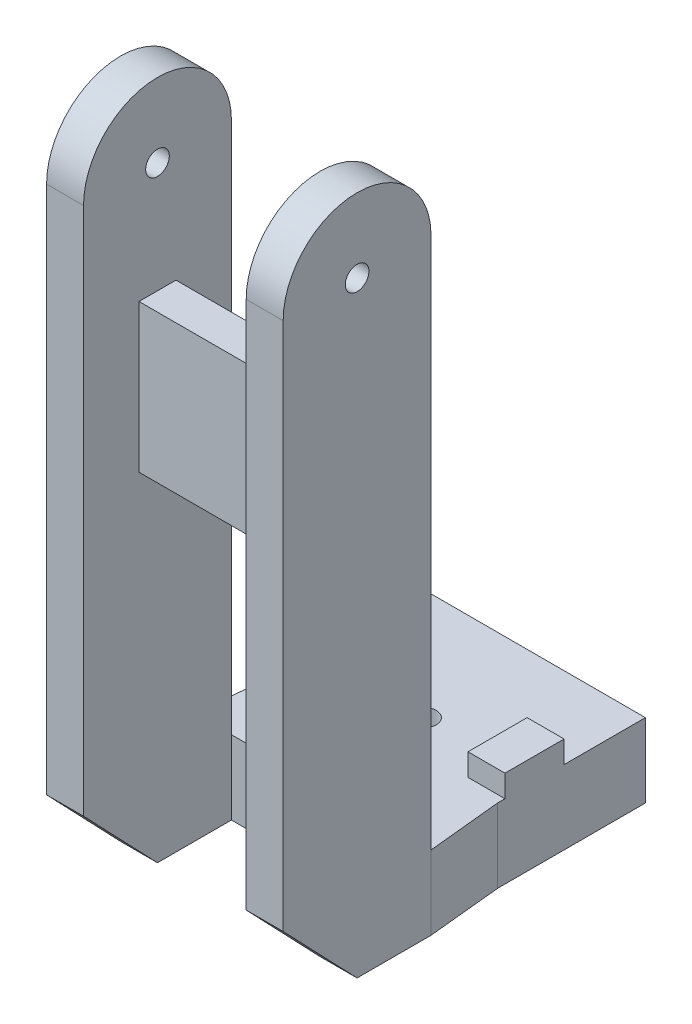
ISO-10303-21;
HEADER;
FILE_DESCRIPTION(('STEP AP214'),'2;1');
FILE_NAME('part.step','',(''),(''),'','','');
FILE_SCHEMA(('AUTOMOTIVE_DESIGN { 1 0 10303 214 1 1 1 1 }'));
ENDSEC;
DATA;
#1=APPLICATION_CONTEXT('core data for automotive mechanical design processes');
#2=APPLICATION_PROTOCOL_DEFINITION('international standard','automotive_design',2000,#1);
#3=PRODUCT_CONTEXT('',#1,'mechanical');
#4=PRODUCT('Part','Part','',(#3));
#5=PRODUCT_RELATED_PRODUCT_CATEGORY('part','',(#4));
#6=PRODUCT_DEFINITION_FORMATION('','',#4);
#7=PRODUCT_DEFINITION_CONTEXT('part definition',#1,'design');
#8=PRODUCT_DEFINITION('design','',#6,#7);
#9=PRODUCT_DEFINITION_SHAPE('','',#8);
#10=(LENGTH_UNIT() NAMED_UNIT(*) SI_UNIT(.MILLI.,.METRE.));
#11=(NAMED_UNIT(*) PLANE_ANGLE_UNIT() SI_UNIT($,.RADIAN.));
#12=(NAMED_UNIT(*) SI_UNIT($,.STERADIAN.) SOLID_ANGLE_UNIT());
#13=UNCERTAINTY_MEASURE_WITH_UNIT(LENGTH_MEASURE(1.E-05),#10,'distance_accuracy_value','');
#14=(GEOMETRIC_REPRESENTATION_CONTEXT(3) GLOBAL_UNCERTAINTY_ASSIGNED_CONTEXT((#13)) GLOBAL_UNIT_ASSIGNED_CONTEXT((#10,
#11,#12)) REPRESENTATION_CONTEXT('',''));
#15=CARTESIAN_POINT('',(0.,0.,0.));
#16=DIRECTION('',(0.,0.,1.));
#17=DIRECTION('',(1.,0.,0.));
#18=AXIS2_PLACEMENT_3D('',#15,#16,#17);
#19=CARTESIAN_POINT('',(4.,72.,10.));
#20=DIRECTION('',(1.,0.,0.));
#21=DIRECTION('',(0.,0.,-1.));
#22=AXIS2_PLACEMENT_3D('',#19,#20,#21);
#23=PLANE('',#22);
#24=CARTESIAN_POINT('',(4.,72.,10.));
#25=DIRECTION('',(1.,0.,0.));
#26=DIRECTION('',(0.,0.,-1.));
#27=AXIS2_PLACEMENT_3D('',#24,#25,#26);
#28=CIRCLE('',#27,1.6);
#29=CARTESIAN_POINT('',(4.,72.,8.4));
#30=VERTEX_POINT('',#29);
#31=EDGE_CURVE('E250',#30,#30,#28,.T.);
#32=ORIENTED_EDGE('',*,*,#31,.F.);
#33=EDGE_LOOP('',(#32));
#34=FACE_BOUND('',#33,.T.);
#35=DIRECTION('',(0.,0.,-1.));
#36=VECTOR('',#35,1.);
#37=CARTESIAN_POINT('',(4.,-10.,10.));
#38=LINE('',#37,#36);
#39=CARTESIAN_POINT('',(4.,-10.,10.));
#40=VERTEX_POINT('',#39);
#41=CARTESIAN_POINT('',(4.,-10.,0.));
#42=VERTEX_POINT('',#41);
#43=EDGE_CURVE('E251',#40,#42,#38,.T.);
#44=ORIENTED_EDGE('',*,*,#43,.T.);
#45=DIRECTION('',(0.,1.,0.));
#46=VECTOR('',#45,1.);
#47=CARTESIAN_POINT('',(4.,-10.,0.));
#48=LINE('',#47,#46);
#49=CARTESIAN_POINT('',(4.,0.,0.));
#50=VERTEX_POINT('',#49);
#51=EDGE_CURVE('E256',#42,#50,#48,.T.);
#52=ORIENTED_EDGE('',*,*,#51,.T.);
#53=CARTESIAN_POINT('',(4.,72.,0.));
#54=VERTEX_POINT('',#53);
#55=EDGE_CURVE('E254',#50,#54,#48,.T.);
#56=ORIENTED_EDGE('',*,*,#55,.T.);
#57=CARTESIAN_POINT('',(4.,72.,10.));
#58=DIRECTION('',(1.,0.,0.));
#59=DIRECTION('',(0.,0.,-1.));
#60=AXIS2_PLACEMENT_3D('',#57,#58,#59);
#61=CIRCLE('',#60,10.);
#62=CARTESIAN_POINT('',(4.,72.,20.));
#63=VERTEX_POINT('',#62);
#64=EDGE_CURVE('E259',#54,#63,#61,.T.);
#65=ORIENTED_EDGE('',*,*,#64,.T.);
#66=DIRECTION('',(0.,-1.,0.));
#67=VECTOR('',#66,1.);
#68=CARTESIAN_POINT('',(4.,72.,20.));
#69=LINE('',#68,#67);
#70=CARTESIAN_POINT('',(4.,0.454209648206035,20.));
#71=VERTEX_POINT('',#70);
#72=EDGE_CURVE('E261',#63,#71,#69,.T.);
#73=ORIENTED_EDGE('',*,*,#72,.T.);
#74=DIRECTION('',(0.,-0.722630766582171,-0.691234240463292));
#75=VECTOR('',#74,1.);
#76=CARTESIAN_POINT('',(4.,-10.,10.));
#77=LINE('',#76,#75);
#78=EDGE_CURVE('E263',#71,#40,#77,.T.);
#79=ORIENTED_EDGE('',*,*,#78,.T.);
#80=EDGE_LOOP('',(#44,#52,#56,#65,#73,#79));
#81=FACE_BOUND('',#80,.T.);
#82=DIRECTION('',(0.,0.,-1.));
#83=VECTOR('',#82,1.);
#84=CARTESIAN_POINT('',(4.,37.,12.5));
#85=LINE('',#84,#83);
#86=CARTESIAN_POINT('',(4.,37.,12.5));
#87=VERTEX_POINT('',#86);
#88=CARTESIAN_POINT('',(4.,37.,7.5));
#89=VERTEX_POINT('',#88);
#90=EDGE_CURVE('E245',#87,#89,#85,.T.);
#91=ORIENTED_EDGE('',*,*,#90,.F.);
#92=DIRECTION('',(0.,-1.,0.));
#93=VECTOR('',#92,1.);
#94=CARTESIAN_POINT('',(4.,57.,12.5));
#95=LINE('',#94,#93);
#96=CARTESIAN_POINT('',(4.,57.,12.5));
#97=VERTEX_POINT('',#96);
#98=EDGE_CURVE('E246',#97,#87,#95,.T.);
#99=ORIENTED_EDGE('',*,*,#98,.F.);
#100=DIRECTION('',(0.,0.,1.));
#101=VECTOR('',#100,1.);
#102=CARTESIAN_POINT('',(4.,57.,12.5));
#103=LINE('',#102,#101);
#104=CARTESIAN_POINT('',(4.,57.,7.5));
#105=VERTEX_POINT('',#104);
#106=EDGE_CURVE('E234',#105,#97,#103,.T.);
#107=ORIENTED_EDGE('',*,*,#106,.F.);
#108=DIRECTION('',(0.,1.,0.));
#109=VECTOR('',#108,1.);
#110=CARTESIAN_POINT('',(4.,57.,7.5));
#111=LINE('',#110,#109);
#112=EDGE_CURVE('E52',#89,#105,#111,.T.);
#113=ORIENTED_EDGE('',*,*,#112,.F.);
#114=EDGE_LOOP('',(#91,#99,#107,#113));
#115=FACE_BOUND('',#114,.T.);
#116=ADVANCED_FACE('F35',(#34,#81,#115),#23,.T.);
#117=CARTESIAN_POINT('',(26.,72.,10.));
#118=DIRECTION('',(1.,0.,0.));
#119=DIRECTION('',(0.,0.,-1.));
#120=AXIS2_PLACEMENT_3D('',#117,#118,#119);
#121=PLANE('',#120);
#122=CARTESIAN_POINT('',(26.,72.,10.));
#123=DIRECTION('',(1.,0.,0.));
#124=DIRECTION('',(0.,0.,-1.));
#125=AXIS2_PLACEMENT_3D('',#122,#123,#124);
#126=CIRCLE('',#125,1.6);
#127=CARTESIAN_POINT('',(26.,72.,8.4));
#128=VERTEX_POINT('',#127);
#129=EDGE_CURVE('E825',#128,#128,#126,.T.);
#130=ORIENTED_EDGE('',*,*,#129,.T.);
#131=EDGE_LOOP('',(#130));
#132=FACE_BOUND('',#131,.T.);
#133=DIRECTION('',(0.,0.,-1.));
#134=VECTOR('',#133,1.);
#135=CARTESIAN_POINT('',(26.,-10.,10.));
#136=LINE('',#135,#134);
#137=CARTESIAN_POINT('',(26.,-10.,10.));
#138=VERTEX_POINT('',#137);
#139=CARTESIAN_POINT('',(26.,-10.,0.));
#140=VERTEX_POINT('',#139);
#141=EDGE_CURVE('E227',#138,#140,#136,.T.);
#142=ORIENTED_EDGE('',*,*,#141,.F.);
#143=DIRECTION('',(0.,-0.722630766582171,-0.691234240463292));
#144=VECTOR('',#143,1.);
#145=CARTESIAN_POINT('',(26.,-10.,10.));
#146=LINE('',#145,#144);
#147=CARTESIAN_POINT('',(26.,0.454209648206035,20.));
#148=VERTEX_POINT('',#147);
#149=EDGE_CURVE('E255',#148,#138,#146,.T.);
#150=ORIENTED_EDGE('',*,*,#149,.F.);
#151=DIRECTION('',(0.,-1.,0.));
#152=VECTOR('',#151,1.);
#153=CARTESIAN_POINT('',(26.,10.9084192964121,20.));
#154=LINE('',#153,#152);
#155=CARTESIAN_POINT('',(26.,72.,20.));
#156=VERTEX_POINT('',#155);
#157=EDGE_CURVE('E275',#156,#148,#154,.T.);
#158=ORIENTED_EDGE('',*,*,#157,.F.);
#159=CARTESIAN_POINT('',(26.,72.,10.));
#160=DIRECTION('',(1.,0.,0.));
#161=DIRECTION('',(0.,0.,-1.));
#162=AXIS2_PLACEMENT_3D('',#159,#160,#161);
#163=CIRCLE('',#162,10.);
#164=CARTESIAN_POINT('',(26.,72.,0.));
#165=VERTEX_POINT('',#164);
#166=EDGE_CURVE('E272',#165,#156,#163,.T.);
#167=ORIENTED_EDGE('',*,*,#166,.F.);
#168=DIRECTION('',(0.,1.,0.));
#169=VECTOR('',#168,1.);
#170=CARTESIAN_POINT('',(26.,15.,0.));
#171=LINE('',#170,#169);
#172=CARTESIAN_POINT('',(26.,0.,0.));
#173=VERTEX_POINT('',#172);
#174=EDGE_CURVE('E268',#173,#165,#171,.T.);
#175=ORIENTED_EDGE('',*,*,#174,.F.);
#176=EDGE_CURVE('E269',#140,#173,#171,.T.);
#177=ORIENTED_EDGE('',*,*,#176,.F.);
#178=EDGE_LOOP('',(#142,#150,#158,#167,#175,#177));
#179=FACE_BOUND('',#178,.T.);
#180=DIRECTION('',(0.,-1.,0.));
#181=VECTOR('',#180,1.);
#182=CARTESIAN_POINT('',(26.,57.,12.5));
#183=LINE('',#182,#181);
#184=CARTESIAN_POINT('',(26.,57.,12.5));
#185=VERTEX_POINT('',#184);
#186=CARTESIAN_POINT('',(26.,37.,12.5));
#187=VERTEX_POINT('',#186);
#188=EDGE_CURVE('E60',#185,#187,#183,.T.);
#189=ORIENTED_EDGE('',*,*,#188,.T.);
#190=DIRECTION('',(0.,0.,-1.));
#191=VECTOR('',#190,1.);
#192=CARTESIAN_POINT('',(26.,37.,12.5));
#193=LINE('',#192,#191);
#194=CARTESIAN_POINT('',(26.,37.,7.5));
#195=VERTEX_POINT('',#194);
#196=EDGE_CURVE('E225',#187,#195,#193,.T.);
#197=ORIENTED_EDGE('',*,*,#196,.T.);
#198=DIRECTION('',(0.,1.,0.));
#199=VECTOR('',#198,1.);
#200=CARTESIAN_POINT('',(26.,57.,7.5));
#201=LINE('',#200,#199);
#202=CARTESIAN_POINT('',(26.,57.,7.5));
#203=VERTEX_POINT('',#202);
#204=EDGE_CURVE('E220',#195,#203,#201,.T.);
#205=ORIENTED_EDGE('',*,*,#204,.T.);
#206=DIRECTION('',(0.,0.,1.));
#207=VECTOR('',#206,1.);
#208=CARTESIAN_POINT('',(26.,57.,12.5));
#209=LINE('',#208,#207);
#210=EDGE_CURVE('E223',#203,#185,#209,.T.);
#211=ORIENTED_EDGE('',*,*,#210,.T.);
#212=EDGE_LOOP('',(#189,#197,#205,#211));
#213=FACE_BOUND('',#212,.T.);
#214=ADVANCED_FACE('F221',(#132,#179,#213),#121,.F.);
#215=CARTESIAN_POINT('',(0.,-10.,0.));
#216=DIRECTION('',(0.,1.,0.));
#217=DIRECTION('',(0.,0.,1.));
#218=AXIS2_PLACEMENT_3D('',#215,#216,#217);
#219=PLANE('',#218);
#220=CARTESIAN_POINT('',(15.,-10.,-15.));
#221=DIRECTION('',(0.,-1.,0.));
#222=DIRECTION('',(0.,0.,-1.));
#223=AXIS2_PLACEMENT_3D('',#220,#221,#222);
#224=CIRCLE('',#223,3.15);
#225=CARTESIAN_POINT('',(15.,-10.,-18.15));
#226=VERTEX_POINT('',#225);
#227=EDGE_CURVE('E332',#226,#226,#224,.T.);
#228=ORIENTED_EDGE('',*,*,#227,.F.);
#229=EDGE_LOOP('',(#228));
#230=FACE_BOUND('',#229,.T.);
#231=ORIENTED_EDGE('',*,*,#43,.F.);
#232=DIRECTION('',(-1.,0.,0.));
#233=VECTOR('',#232,1.);
#234=CARTESIAN_POINT('',(31.,-10.,10.));
#235=LINE('',#234,#233);
#236=CARTESIAN_POINT('',(-1.,-10.,10.));
#237=VERTEX_POINT('',#236);
#238=EDGE_CURVE('E297',#40,#237,#235,.T.);
#239=ORIENTED_EDGE('',*,*,#238,.T.);
#240=DIRECTION('',(0.,0.,-1.));
#241=VECTOR('',#240,1.);
#242=CARTESIAN_POINT('',(-1.,-10.,10.));
#243=LINE('',#242,#241);
#244=CARTESIAN_POINT('',(-1.,-10.,0.));
#245=VERTEX_POINT('',#244);
#246=EDGE_CURVE('E284',#237,#245,#243,.T.);
#247=ORIENTED_EDGE('',*,*,#246,.T.);
#248=DIRECTION('',(-0.099503719020999,0.,0.995037190209989));
#249=VECTOR('',#248,1.);
#250=CARTESIAN_POINT('',(0.,-10.,-10.));
#251=LINE('',#250,#249);
#252=CARTESIAN_POINT('',(0.,-10.,-10.));
#253=VERTEX_POINT('',#252);
#254=EDGE_CURVE('E405',#253,#245,#251,.T.);
#255=ORIENTED_EDGE('',*,*,#254,.F.);
#256=DIRECTION('',(0.,0.,1.));
#257=VECTOR('',#256,1.);
#258=CARTESIAN_POINT('',(0.,-10.,-10.));
#259=LINE('',#258,#257);
#260=CARTESIAN_POINT('',(0.,-10.,-30.));
#261=VERTEX_POINT('',#260);
#262=EDGE_CURVE('E402',#261,#253,#259,.T.);
#263=ORIENTED_EDGE('',*,*,#262,.F.);
#264=DIRECTION('',(-1.,0.,0.));
#265=VECTOR('',#264,1.);
#266=CARTESIAN_POINT('',(0.,-10.,-30.));
#267=LINE('',#266,#265);
#268=CARTESIAN_POINT('',(30.,-10.,-30.));
#269=VERTEX_POINT('',#268);
#270=EDGE_CURVE('E399',#269,#261,#267,.T.);
#271=ORIENTED_EDGE('',*,*,#270,.F.);
#272=DIRECTION('',(0.,0.,-1.));
#273=VECTOR('',#272,1.);
#274=CARTESIAN_POINT('',(30.,-10.,-10.));
#275=LINE('',#274,#273);
#276=CARTESIAN_POINT('',(30.,-10.,-10.));
#277=VERTEX_POINT('',#276);
#278=EDGE_CURVE('E395',#277,#269,#275,.T.);
#279=ORIENTED_EDGE('',*,*,#278,.F.);
#280=DIRECTION('',(-0.099503719020999,0.,-0.995037190209989));
#281=VECTOR('',#280,1.);
#282=CARTESIAN_POINT('',(31.,-10.,0.));
#283=LINE('',#282,#281);
#284=CARTESIAN_POINT('',(31.,-10.,0.));
#285=VERTEX_POINT('',#284);
#286=EDGE_CURVE('E392',#285,#277,#283,.T.);
#287=ORIENTED_EDGE('',*,*,#286,.F.);
#288=DIRECTION('',(0.,0.,-1.));
#289=VECTOR('',#288,1.);
#290=CARTESIAN_POINT('',(31.,-10.,10.));
#291=LINE('',#290,#289);
#292=CARTESIAN_POINT('',(31.,-10.,10.));
#293=VERTEX_POINT('',#292);
#294=EDGE_CURVE('E285',#293,#285,#291,.T.);
#295=ORIENTED_EDGE('',*,*,#294,.F.);
#296=EDGE_CURVE('E311',#293,#138,#235,.T.);
#297=ORIENTED_EDGE('',*,*,#296,.T.);
#298=ORIENTED_EDGE('',*,*,#141,.T.);
#299=DIRECTION('',(1.,0.,0.));
#300=VECTOR('',#299,1.);
#301=CARTESIAN_POINT('',(4.,-10.,0.));
#302=LINE('',#301,#300);
#303=EDGE_CURVE('E265',#42,#140,#302,.T.);
#304=ORIENTED_EDGE('',*,*,#303,.F.);
#305=EDGE_LOOP('',(#231,#239,#247,#255,#263,#271,#279,#287,#295,#297,#298,#304));
#306=FACE_BOUND('',#305,.T.);
#307=ADVANCED_FACE('F462',(#230,#306),#219,.F.);
#308=CARTESIAN_POINT('',(31.,15.,0.));
#309=DIRECTION('',(0.,0.,1.));
#310=DIRECTION('',(1.,0.,0.));
#311=AXIS2_PLACEMENT_3D('',#308,#309,#310);
#312=PLANE('',#311);
#313=ORIENTED_EDGE('',*,*,#55,.F.);
#314=DIRECTION('',(1.,0.,0.));
#315=VECTOR('',#314,1.);
#316=CARTESIAN_POINT('',(30.,0.,0.));
#317=LINE('',#316,#315);
#318=CARTESIAN_POINT('',(-1.,0.,0.));
#319=VERTEX_POINT('',#318);
#320=EDGE_CURVE('E407',#319,#50,#317,.T.);
#321=ORIENTED_EDGE('',*,*,#320,.F.);
#322=DIRECTION('',(0.,1.,0.));
#323=VECTOR('',#322,1.);
#324=CARTESIAN_POINT('',(-1.,15.,0.));
#325=LINE('',#324,#323);
#326=CARTESIAN_POINT('',(-1.,72.,0.));
#327=VERTEX_POINT('',#326);
#328=EDGE_CURVE('E300',#319,#327,#325,.T.);
#329=ORIENTED_EDGE('',*,*,#328,.T.);
#330=DIRECTION('',(-1.,0.,0.));
#331=VECTOR('',#330,1.);
#332=CARTESIAN_POINT('',(31.,72.,0.));
#333=LINE('',#332,#331);
#334=EDGE_CURVE('E322',#54,#327,#333,.T.);
#335=ORIENTED_EDGE('',*,*,#334,.F.);
#336=EDGE_LOOP('',(#313,#321,#329,#335));
#337=FACE_BOUND('',#336,.T.);
#338=ADVANCED_FACE('F537',(#337),#312,.F.);
#339=CARTESIAN_POINT('',(31.,72.,10.));
#340=DIRECTION('',(-1.,0.,0.));
#341=DIRECTION('',(0.,0.,1.));
#342=AXIS2_PLACEMENT_3D('',#339,#340,#341);
#343=CYLINDRICAL_SURFACE('',#342,10.);
#344=ORIENTED_EDGE('',*,*,#64,.F.);
#345=ORIENTED_EDGE('',*,*,#334,.T.);
#346=CARTESIAN_POINT('',(-1.,72.,10.));
#347=DIRECTION('',(1.,0.,0.));
#348=DIRECTION('',(0.,0.,-1.));
#349=AXIS2_PLACEMENT_3D('',#346,#347,#348);
#350=CIRCLE('',#349,10.);
#351=CARTESIAN_POINT('',(-1.,72.,20.));
#352=VERTEX_POINT('',#351);
#353=EDGE_CURVE('E303',#327,#352,#350,.T.);
#354=ORIENTED_EDGE('',*,*,#353,.T.);
#355=DIRECTION('',(-1.,0.,0.));
#356=VECTOR('',#355,1.);
#357=CARTESIAN_POINT('',(31.,72.,20.));
#358=LINE('',#357,#356);
#359=EDGE_CURVE('E318',#63,#352,#358,.T.);
#360=ORIENTED_EDGE('',*,*,#359,.F.);
#361=EDGE_LOOP('',(#344,#345,#354,#360));
#362=FACE_BOUND('',#361,.T.);
#363=ADVANCED_FACE('F534',(#362),#343,.T.);
#364=CARTESIAN_POINT('',(31.,10.9084192964121,20.));
#365=DIRECTION('',(0.,0.,-1.));
#366=DIRECTION('',(-1.,0.,0.));
#367=AXIS2_PLACEMENT_3D('',#364,#365,#366);
#368=PLANE('',#367);
#369=ORIENTED_EDGE('',*,*,#72,.F.);
#370=ORIENTED_EDGE('',*,*,#359,.T.);
#371=DIRECTION('',(0.,-1.,0.));
#372=VECTOR('',#371,1.);
#373=CARTESIAN_POINT('',(-1.,10.9084192964121,20.));
#374=LINE('',#373,#372);
#375=CARTESIAN_POINT('',(-1.,0.454209648206035,20.));
#376=VERTEX_POINT('',#375);
#377=EDGE_CURVE('E306',#352,#376,#374,.T.);
#378=ORIENTED_EDGE('',*,*,#377,.T.);
#379=DIRECTION('',(-1.,0.,0.));
#380=VECTOR('',#379,1.);
#381=CARTESIAN_POINT('',(31.,0.454209648206035,20.));
#382=LINE('',#381,#380);
#383=EDGE_CURVE('E314',#71,#376,#382,.T.);
#384=ORIENTED_EDGE('',*,*,#383,.F.);
#385=EDGE_LOOP('',(#369,#370,#378,#384));
#386=FACE_BOUND('',#385,.T.);
#387=ADVANCED_FACE('F531',(#386),#368,.F.);
#388=CARTESIAN_POINT('',(31.,-10.,10.));
#389=DIRECTION('',(0.,0.691234240463292,-0.722630766582171));
#390=DIRECTION('',(0.,0.722630766582171,0.691234240463292));
#391=AXIS2_PLACEMENT_3D('',#388,#389,#390);
#392=PLANE('',#391);
#393=ORIENTED_EDGE('',*,*,#78,.F.);
#394=ORIENTED_EDGE('',*,*,#383,.T.);
#395=DIRECTION('',(0.,-0.722630766582171,-0.691234240463292));
#396=VECTOR('',#395,1.);
#397=CARTESIAN_POINT('',(-1.,-10.,10.));
#398=LINE('',#397,#396);
#399=EDGE_CURVE('E289',#376,#237,#398,.T.);
#400=ORIENTED_EDGE('',*,*,#399,.T.);
#401=ORIENTED_EDGE('',*,*,#238,.F.);
#402=EDGE_LOOP('',(#393,#394,#400,#401));
#403=FACE_BOUND('',#402,.T.);
#404=ADVANCED_FACE('F528',(#403),#392,.F.);
#405=CARTESIAN_POINT('',(0.,0.,0.));
#406=DIRECTION('',(0.,1.,0.));
#407=DIRECTION('',(0.,0.,1.));
#408=AXIS2_PLACEMENT_3D('',#405,#406,#407);
#409=PLANE('',#408);
#410=DIRECTION('',(0.,0.,1.));
#411=VECTOR('',#410,1.);
#412=CARTESIAN_POINT('',(25.,0.,-19.));
#413=LINE('',#412,#411);
#414=CARTESIAN_POINT('',(25.,0.,-19.));
#415=VERTEX_POINT('',#414);
#416=CARTESIAN_POINT('',(25.,0.,-11.));
#417=VERTEX_POINT('',#416);
#418=EDGE_CURVE('E348',#415,#417,#413,.T.);
#419=ORIENTED_EDGE('',*,*,#418,.F.);
#420=DIRECTION('',(-1.,0.,0.));
#421=VECTOR('',#420,1.);
#422=CARTESIAN_POINT('',(30.,0.,-19.));
#423=LINE('',#422,#421);
#424=CARTESIAN_POINT('',(30.,0.,-19.));
#425=VERTEX_POINT('',#424);
#426=EDGE_CURVE('E335',#425,#415,#423,.T.);
#427=ORIENTED_EDGE('',*,*,#426,.F.);
#428=DIRECTION('',(0.,0.,-1.));
#429=VECTOR('',#428,1.);
#430=CARTESIAN_POINT('',(30.,0.,-10.));
#431=LINE('',#430,#429);
#432=CARTESIAN_POINT('',(30.,0.,-30.));
#433=VERTEX_POINT('',#432);
#434=EDGE_CURVE('E413',#425,#433,#431,.T.);
#435=ORIENTED_EDGE('',*,*,#434,.T.);
#436=DIRECTION('',(-1.,0.,0.));
#437=VECTOR('',#436,1.);
#438=CARTESIAN_POINT('',(0.,0.,-30.));
#439=LINE('',#438,#437);
#440=CARTESIAN_POINT('',(0.,0.,-30.));
#441=VERTEX_POINT('',#440);
#442=EDGE_CURVE('E417',#433,#441,#439,.T.);
#443=ORIENTED_EDGE('',*,*,#442,.T.);
#444=DIRECTION('',(0.,0.,1.));
#445=VECTOR('',#444,1.);
#446=CARTESIAN_POINT('',(0.,0.,-10.));
#447=LINE('',#446,#445);
#448=CARTESIAN_POINT('',(0.,0.,-19.));
#449=VERTEX_POINT('',#448);
#450=EDGE_CURVE('E421',#441,#449,#447,.T.);
#451=ORIENTED_EDGE('',*,*,#450,.T.);
#452=DIRECTION('',(-1.,0.,0.));
#453=VECTOR('',#452,1.);
#454=CARTESIAN_POINT('',(0.,0.,-19.));
#455=LINE('',#454,#453);
#456=CARTESIAN_POINT('',(5.,0.,-19.));
#457=VERTEX_POINT('',#456);
#458=EDGE_CURVE('E366',#457,#449,#455,.T.);
#459=ORIENTED_EDGE('',*,*,#458,.F.);
#460=DIRECTION('',(0.,0.,-1.));
#461=VECTOR('',#460,1.);
#462=CARTESIAN_POINT('',(5.,0.,-19.));
#463=LINE('',#462,#461);
#464=CARTESIAN_POINT('',(5.,0.,-11.));
#465=VERTEX_POINT('',#464);
#466=EDGE_CURVE('E375',#465,#457,#463,.T.);
#467=ORIENTED_EDGE('',*,*,#466,.F.);
#468=DIRECTION('',(1.,0.,0.));
#469=VECTOR('',#468,1.);
#470=CARTESIAN_POINT('',(0.,0.,-11.));
#471=LINE('',#470,#469);
#472=CARTESIAN_POINT('',(0.,0.,-11.));
#473=VERTEX_POINT('',#472);
#474=EDGE_CURVE('E361',#473,#465,#471,.T.);
#475=ORIENTED_EDGE('',*,*,#474,.F.);
#476=CARTESIAN_POINT('',(0.,0.,-10.));
#477=VERTEX_POINT('',#476);
#478=EDGE_CURVE('E420',#473,#477,#447,.T.);
#479=ORIENTED_EDGE('',*,*,#478,.T.);
#480=DIRECTION('',(-0.099503719020999,0.,0.995037190209989));
#481=VECTOR('',#480,1.);
#482=CARTESIAN_POINT('',(0.,0.,-10.));
#483=LINE('',#482,#481);
#484=EDGE_CURVE('E396',#477,#319,#483,.T.);
#485=ORIENTED_EDGE('',*,*,#484,.T.);
#486=ORIENTED_EDGE('',*,*,#320,.T.);
#487=DIRECTION('',(-1.,0.,0.));
#488=VECTOR('',#487,1.);
#489=CARTESIAN_POINT('',(0.,0.,0.));
#490=LINE('',#489,#488);
#491=EDGE_CURVE('E282',#173,#50,#490,.T.);
#492=ORIENTED_EDGE('',*,*,#491,.F.);
#493=CARTESIAN_POINT('',(31.,0.,0.));
#494=VERTEX_POINT('',#493);
#495=EDGE_CURVE('E391',#173,#494,#317,.T.);
#496=ORIENTED_EDGE('',*,*,#495,.T.);
#497=DIRECTION('',(-0.099503719020999,0.,-0.995037190209989));
#498=VECTOR('',#497,1.);
#499=CARTESIAN_POINT('',(31.,0.,0.));
#500=LINE('',#499,#498);
#501=CARTESIAN_POINT('',(30.,0.,-10.));
#502=VERTEX_POINT('',#501);
#503=EDGE_CURVE('E410',#494,#502,#500,.T.);
#504=ORIENTED_EDGE('',*,*,#503,.T.);
#505=CARTESIAN_POINT('',(30.,0.,-11.));
#506=VERTEX_POINT('',#505);
#507=EDGE_CURVE('E414',#502,#506,#431,.T.);
#508=ORIENTED_EDGE('',*,*,#507,.T.);
#509=DIRECTION('',(1.,0.,0.));
#510=VECTOR('',#509,1.);
#511=CARTESIAN_POINT('',(30.,0.,-11.));
#512=LINE('',#511,#510);
#513=EDGE_CURVE('E340',#417,#506,#512,.T.);
#514=ORIENTED_EDGE('',*,*,#513,.F.);
#515=EDGE_LOOP('',(#419,#427,#435,#443,#451,#459,#467,#475,#479,#485,#486,#492,#496,#504,#508,#514));
#516=FACE_BOUND('',#515,.T.);
#517=CARTESIAN_POINT('',(15.,0.,-15.));
#518=DIRECTION('',(0.,-1.,0.));
#519=DIRECTION('',(0.,0.,-1.));
#520=AXIS2_PLACEMENT_3D('',#517,#518,#519);
#521=CIRCLE('',#520,1.7);
#522=CARTESIAN_POINT('',(15.,0.,-16.7));
#523=VERTEX_POINT('',#522);
#524=EDGE_CURVE('E326',#523,#523,#521,.T.);
#525=ORIENTED_EDGE('',*,*,#524,.T.);
#526=EDGE_LOOP('',(#525));
#527=FACE_BOUND('',#526,.T.);
#528=ADVANCED_FACE('F474',(#516,#527),#409,.T.);
#529=CARTESIAN_POINT('',(0.,-10.,-10.));
#530=DIRECTION('',(-0.995037190209989,0.,-0.099503719020999));
#531=DIRECTION('',(-0.099503719020999,0.,0.995037190209989));
#532=AXIS2_PLACEMENT_3D('',#529,#530,#531);
#533=PLANE('',#532);
#534=ORIENTED_EDGE('',*,*,#484,.F.);
#535=DIRECTION('',(0.,1.,0.));
#536=VECTOR('',#535,1.);
#537=CARTESIAN_POINT('',(0.,-10.,-10.));
#538=LINE('',#537,#536);
#539=EDGE_CURVE('E44',#253,#477,#538,.T.);
#540=ORIENTED_EDGE('',*,*,#539,.F.);
#541=ORIENTED_EDGE('',*,*,#254,.T.);
#542=DIRECTION('',(0.,1.,0.));
#543=VECTOR('',#542,1.);
#544=CARTESIAN_POINT('',(-1.,-10.,0.));
#545=LINE('',#544,#543);
#546=EDGE_CURVE('E11',#245,#319,#545,.T.);
#547=ORIENTED_EDGE('',*,*,#546,.T.);
#548=EDGE_LOOP('',(#534,#540,#541,#547));
#549=FACE_BOUND('',#548,.T.);
#550=ADVANCED_FACE('F560',(#549),#533,.T.);
#551=CARTESIAN_POINT('',(0.,-10.,-10.));
#552=DIRECTION('',(-1.,0.,0.));
#553=DIRECTION('',(0.,0.,1.));
#554=AXIS2_PLACEMENT_3D('',#551,#552,#553);
#555=PLANE('',#554);
#556=ORIENTED_EDGE('',*,*,#450,.F.);
#557=DIRECTION('',(0.,1.,0.));
#558=VECTOR('',#557,1.);
#559=CARTESIAN_POINT('',(0.,-10.,-30.));
#560=LINE('',#559,#558);
#561=EDGE_CURVE('E427',#261,#441,#560,.T.);
#562=ORIENTED_EDGE('',*,*,#561,.F.);
#563=ORIENTED_EDGE('',*,*,#262,.T.);
#564=ORIENTED_EDGE('',*,*,#539,.T.);
#565=ORIENTED_EDGE('',*,*,#478,.F.);
#566=DIRECTION('',(0.,-1.,0.));
#567=VECTOR('',#566,1.);
#568=CARTESIAN_POINT('',(0.,3.,-11.));
#569=LINE('',#568,#567);
#570=CARTESIAN_POINT('',(0.,3.,-11.));
#571=VERTEX_POINT('',#570);
#572=EDGE_CURVE('E388',#571,#473,#569,.T.);
#573=ORIENTED_EDGE('',*,*,#572,.F.);
#574=DIRECTION('',(0.,0.,1.));
#575=VECTOR('',#574,1.);
#576=CARTESIAN_POINT('',(0.,3.,-19.));
#577=LINE('',#576,#575);
#578=CARTESIAN_POINT('',(0.,3.,-19.));
#579=VERTEX_POINT('',#578);
#580=EDGE_CURVE('E362',#579,#571,#577,.T.);
#581=ORIENTED_EDGE('',*,*,#580,.F.);
#582=DIRECTION('',(0.,-1.,0.));
#583=VECTOR('',#582,1.);
#584=CARTESIAN_POINT('',(0.,3.,-19.));
#585=LINE('',#584,#583);
#586=EDGE_CURVE('E372',#579,#449,#585,.T.);
#587=ORIENTED_EDGE('',*,*,#586,.T.);
#588=EDGE_LOOP('',(#556,#562,#563,#564,#565,#573,#581,#587));
#589=FACE_BOUND('',#588,.T.);
#590=ADVANCED_FACE('F563',(#589),#555,.T.);
#591=CARTESIAN_POINT('',(0.,-10.,-30.));
#592=DIRECTION('',(0.,0.,-1.));
#593=DIRECTION('',(-1.,0.,0.));
#594=AXIS2_PLACEMENT_3D('',#591,#592,#593);
#595=PLANE('',#594);
#596=ORIENTED_EDGE('',*,*,#442,.F.);
#597=DIRECTION('',(0.,1.,0.));
#598=VECTOR('',#597,1.);
#599=CARTESIAN_POINT('',(30.,-10.,-30.));
#600=LINE('',#599,#598);
#601=EDGE_CURVE('E429',#269,#433,#600,.T.);
#602=ORIENTED_EDGE('',*,*,#601,.F.);
#603=ORIENTED_EDGE('',*,*,#270,.T.);
#604=ORIENTED_EDGE('',*,*,#561,.T.);
#605=EDGE_LOOP('',(#596,#602,#603,#604));
#606=FACE_BOUND('',#605,.T.);
#607=ADVANCED_FACE('F567',(#606),#595,.T.);
#608=CARTESIAN_POINT('',(30.,-10.,-10.));
#609=DIRECTION('',(1.,0.,0.));
#610=DIRECTION('',(0.,0.,-1.));
#611=AXIS2_PLACEMENT_3D('',#608,#609,#610);
#612=PLANE('',#611);
#613=ORIENTED_EDGE('',*,*,#507,.F.);
#614=DIRECTION('',(0.,1.,0.));
#615=VECTOR('',#614,1.);
#616=CARTESIAN_POINT('',(30.,-10.,-10.));
#617=LINE('',#616,#615);
#618=EDGE_CURVE('E431',#277,#502,#617,.T.);
#619=ORIENTED_EDGE('',*,*,#618,.F.);
#620=ORIENTED_EDGE('',*,*,#278,.T.);
#621=ORIENTED_EDGE('',*,*,#601,.T.);
#622=ORIENTED_EDGE('',*,*,#434,.F.);
#623=DIRECTION('',(0.,-1.,0.));
#624=VECTOR('',#623,1.);
#625=CARTESIAN_POINT('',(30.,3.,-19.));
#626=LINE('',#625,#624);
#627=CARTESIAN_POINT('',(30.,3.,-19.));
#628=VERTEX_POINT('',#627);
#629=EDGE_CURVE('E359',#628,#425,#626,.T.);
#630=ORIENTED_EDGE('',*,*,#629,.F.);
#631=DIRECTION('',(0.,0.,-1.));
#632=VECTOR('',#631,1.);
#633=CARTESIAN_POINT('',(30.,3.,-19.));
#634=LINE('',#633,#632);
#635=CARTESIAN_POINT('',(30.,3.,-11.));
#636=VERTEX_POINT('',#635);
#637=EDGE_CURVE('E336',#636,#628,#634,.T.);
#638=ORIENTED_EDGE('',*,*,#637,.F.);
#639=DIRECTION('',(0.,-1.,0.));
#640=VECTOR('',#639,1.);
#641=CARTESIAN_POINT('',(30.,3.,-11.));
#642=LINE('',#641,#640);
#643=EDGE_CURVE('E346',#636,#506,#642,.T.);
#644=ORIENTED_EDGE('',*,*,#643,.T.);
#645=EDGE_LOOP('',(#613,#619,#620,#621,#622,#630,#638,#644));
#646=FACE_BOUND('',#645,.T.);
#647=ADVANCED_FACE('F467',(#646),#612,.T.);
#648=CARTESIAN_POINT('',(31.,-10.,0.));
#649=DIRECTION('',(0.995037190209989,0.,-0.099503719020999));
#650=DIRECTION('',(-0.099503719020999,0.,-0.995037190209989));
#651=AXIS2_PLACEMENT_3D('',#648,#649,#650);
#652=PLANE('',#651);
#653=ORIENTED_EDGE('',*,*,#503,.F.);
#654=DIRECTION('',(0.,1.,0.));
#655=VECTOR('',#654,1.);
#656=CARTESIAN_POINT('',(31.,-10.,0.));
#657=LINE('',#656,#655);
#658=EDGE_CURVE('E39',#285,#494,#657,.T.);
#659=ORIENTED_EDGE('',*,*,#658,.F.);
#660=ORIENTED_EDGE('',*,*,#286,.T.);
#661=ORIENTED_EDGE('',*,*,#618,.T.);
#662=EDGE_LOOP('',(#653,#659,#660,#661));
#663=FACE_BOUND('',#662,.T.);
#664=ADVANCED_FACE('F37',(#663),#652,.T.);
#665=CARTESIAN_POINT('',(0.,3.,-11.));
#666=DIRECTION('',(0.,0.,-1.));
#667=DIRECTION('',(-1.,0.,0.));
#668=AXIS2_PLACEMENT_3D('',#665,#666,#667);
#669=PLANE('',#668);
#670=ORIENTED_EDGE('',*,*,#474,.T.);
#671=DIRECTION('',(0.,-1.,0.));
#672=VECTOR('',#671,1.);
#673=CARTESIAN_POINT('',(5.,3.,-11.));
#674=LINE('',#673,#672);
#675=CARTESIAN_POINT('',(5.,3.,-11.));
#676=VERTEX_POINT('',#675);
#677=EDGE_CURVE('E385',#676,#465,#674,.T.);
#678=ORIENTED_EDGE('',*,*,#677,.F.);
#679=DIRECTION('',(1.,0.,0.));
#680=VECTOR('',#679,1.);
#681=CARTESIAN_POINT('',(0.,3.,-11.));
#682=LINE('',#681,#680);
#683=EDGE_CURVE('E365',#571,#676,#682,.T.);
#684=ORIENTED_EDGE('',*,*,#683,.F.);
#685=ORIENTED_EDGE('',*,*,#572,.T.);
#686=EDGE_LOOP('',(#670,#678,#684,#685));
#687=FACE_BOUND('',#686,.T.);
#688=ADVANCED_FACE('F556',(#687),#669,.F.);
#689=CARTESIAN_POINT('',(5.,3.,-19.));
#690=DIRECTION('',(-1.,0.,0.));
#691=DIRECTION('',(0.,0.,1.));
#692=AXIS2_PLACEMENT_3D('',#689,#690,#691);
#693=PLANE('',#692);
#694=ORIENTED_EDGE('',*,*,#466,.T.);
#695=DIRECTION('',(0.,-1.,0.));
#696=VECTOR('',#695,1.);
#697=CARTESIAN_POINT('',(5.,3.,-19.));
#698=LINE('',#697,#696);
#699=CARTESIAN_POINT('',(5.,3.,-19.));
#700=VERTEX_POINT('',#699);
#701=EDGE_CURVE('E382',#700,#457,#698,.T.);
#702=ORIENTED_EDGE('',*,*,#701,.F.);
#703=DIRECTION('',(0.,0.,-1.));
#704=VECTOR('',#703,1.);
#705=CARTESIAN_POINT('',(5.,3.,-19.));
#706=LINE('',#705,#704);
#707=EDGE_CURVE('E368',#676,#700,#706,.T.);
#708=ORIENTED_EDGE('',*,*,#707,.F.);
#709=ORIENTED_EDGE('',*,*,#677,.T.);
#710=EDGE_LOOP('',(#694,#702,#708,#709));
#711=FACE_BOUND('',#710,.T.);
#712=ADVANCED_FACE('F578',(#711),#693,.F.);
#713=CARTESIAN_POINT('',(0.,3.,-19.));
#714=DIRECTION('',(0.,0.,1.));
#715=DIRECTION('',(1.,0.,0.));
#716=AXIS2_PLACEMENT_3D('',#713,#714,#715);
#717=PLANE('',#716);
#718=ORIENTED_EDGE('',*,*,#458,.T.);
#719=ORIENTED_EDGE('',*,*,#586,.F.);
#720=DIRECTION('',(-1.,0.,0.));
#721=VECTOR('',#720,1.);
#722=CARTESIAN_POINT('',(0.,3.,-19.));
#723=LINE('',#722,#721);
#724=EDGE_CURVE('E370',#700,#579,#723,.T.);
#725=ORIENTED_EDGE('',*,*,#724,.F.);
#726=ORIENTED_EDGE('',*,*,#701,.T.);
#727=EDGE_LOOP('',(#718,#719,#725,#726));
#728=FACE_BOUND('',#727,.T.);
#729=ADVANCED_FACE('F583',(#728),#717,.F.);
#730=CARTESIAN_POINT('',(0.,3.,0.));
#731=DIRECTION('',(0.,1.,0.));
#732=DIRECTION('',(0.,0.,1.));
#733=AXIS2_PLACEMENT_3D('',#730,#731,#732);
#734=PLANE('',#733);
#735=ORIENTED_EDGE('',*,*,#580,.T.);
#736=ORIENTED_EDGE('',*,*,#683,.T.);
#737=ORIENTED_EDGE('',*,*,#707,.T.);
#738=ORIENTED_EDGE('',*,*,#724,.T.);
#739=EDGE_LOOP('',(#735,#736,#737,#738));
#740=FACE_BOUND('',#739,.T.);
#741=ADVANCED_FACE('F592',(#740),#734,.T.);
#742=CARTESIAN_POINT('',(30.,3.,-19.));
#743=DIRECTION('',(0.,0.,1.));
#744=DIRECTION('',(1.,0.,0.));
#745=AXIS2_PLACEMENT_3D('',#742,#743,#744);
#746=PLANE('',#745);
#747=ORIENTED_EDGE('',*,*,#426,.T.);
#748=DIRECTION('',(0.,-1.,0.));
#749=VECTOR('',#748,1.);
#750=CARTESIAN_POINT('',(25.,3.,-19.));
#751=LINE('',#750,#749);
#752=CARTESIAN_POINT('',(25.,3.,-19.));
#753=VERTEX_POINT('',#752);
#754=EDGE_CURVE('E356',#753,#415,#751,.T.);
#755=ORIENTED_EDGE('',*,*,#754,.F.);
#756=DIRECTION('',(-1.,0.,0.));
#757=VECTOR('',#756,1.);
#758=CARTESIAN_POINT('',(30.,3.,-19.));
#759=LINE('',#758,#757);
#760=EDGE_CURVE('E339',#628,#753,#759,.T.);
#761=ORIENTED_EDGE('',*,*,#760,.F.);
#762=ORIENTED_EDGE('',*,*,#629,.T.);
#763=EDGE_LOOP('',(#747,#755,#761,#762));
#764=FACE_BOUND('',#763,.T.);
#765=ADVANCED_FACE('F486',(#764),#746,.F.);
#766=CARTESIAN_POINT('',(25.,3.,-19.));
#767=DIRECTION('',(1.,0.,0.));
#768=DIRECTION('',(0.,0.,-1.));
#769=AXIS2_PLACEMENT_3D('',#766,#767,#768);
#770=PLANE('',#769);
#771=ORIENTED_EDGE('',*,*,#418,.T.);
#772=DIRECTION('',(0.,-1.,0.));
#773=VECTOR('',#772,1.);
#774=CARTESIAN_POINT('',(25.,3.,-11.));
#775=LINE('',#774,#773);
#776=CARTESIAN_POINT('',(25.,3.,-11.));
#777=VERTEX_POINT('',#776);
#778=EDGE_CURVE('E354',#777,#417,#775,.T.);
#779=ORIENTED_EDGE('',*,*,#778,.F.);
#780=DIRECTION('',(0.,0.,1.));
#781=VECTOR('',#780,1.);
#782=CARTESIAN_POINT('',(25.,3.,-19.));
#783=LINE('',#782,#781);
#784=EDGE_CURVE('E342',#753,#777,#783,.T.);
#785=ORIENTED_EDGE('',*,*,#784,.F.);
#786=ORIENTED_EDGE('',*,*,#754,.T.);
#787=EDGE_LOOP('',(#771,#779,#785,#786));
#788=FACE_BOUND('',#787,.T.);
#789=ADVANCED_FACE('F483',(#788),#770,.F.);
#790=CARTESIAN_POINT('',(30.,3.,-11.));
#791=DIRECTION('',(0.,0.,-1.));
#792=DIRECTION('',(-1.,0.,0.));
#793=AXIS2_PLACEMENT_3D('',#790,#791,#792);
#794=PLANE('',#793);
#795=ORIENTED_EDGE('',*,*,#513,.T.);
#796=ORIENTED_EDGE('',*,*,#643,.F.);
#797=DIRECTION('',(1.,0.,0.));
#798=VECTOR('',#797,1.);
#799=CARTESIAN_POINT('',(30.,3.,-11.));
#800=LINE('',#799,#798);
#801=EDGE_CURVE('E344',#777,#636,#800,.T.);
#802=ORIENTED_EDGE('',*,*,#801,.F.);
#803=ORIENTED_EDGE('',*,*,#778,.T.);
#804=EDGE_LOOP('',(#795,#796,#802,#803));
#805=FACE_BOUND('',#804,.T.);
#806=ADVANCED_FACE('F478',(#805),#794,.F.);
#807=CARTESIAN_POINT('',(0.,3.,0.));
#808=DIRECTION('',(0.,-1.,0.));
#809=DIRECTION('',(0.,0.,-1.));
#810=AXIS2_PLACEMENT_3D('',#807,#808,#809);
#811=PLANE('',#810);
#812=ORIENTED_EDGE('',*,*,#637,.T.);
#813=ORIENTED_EDGE('',*,*,#760,.T.);
#814=ORIENTED_EDGE('',*,*,#784,.T.);
#815=ORIENTED_EDGE('',*,*,#801,.T.);
#816=EDGE_LOOP('',(#812,#813,#814,#815));
#817=FACE_BOUND('',#816,.T.);
#818=ADVANCED_FACE('F489',(#817),#811,.F.);
#819=CARTESIAN_POINT('',(15.,-10.,-15.));
#820=DIRECTION('',(0.,-1.,0.));
#821=DIRECTION('',(0.,0.,-1.));
#822=AXIS2_PLACEMENT_3D('',#819,#820,#821);
#823=CONICAL_SURFACE('',#822,3.15,0.785398163397448);
#824=CARTESIAN_POINT('',(15.,-8.55,-15.));
#825=DIRECTION('',(0.,-1.,0.));
#826=DIRECTION('',(0.,0.,-1.));
#827=AXIS2_PLACEMENT_3D('',#824,#825,#826);
#828=CIRCLE('',#827,1.7);
#829=CARTESIAN_POINT('',(15.,-8.55,-16.7));
#830=VERTEX_POINT('',#829);
#831=EDGE_CURVE('E329',#830,#830,#828,.T.);
#832=ORIENTED_EDGE('',*,*,#831,.F.);
#833=EDGE_LOOP('',(#832));
#834=FACE_BOUND('',#833,.T.);
#835=ORIENTED_EDGE('',*,*,#227,.T.);
#836=EDGE_LOOP('',(#835));
#837=FACE_BOUND('',#836,.T.);
#838=ADVANCED_FACE('F491',(#834,#837),#823,.F.);
#839=CARTESIAN_POINT('',(15.,-10.,-15.));
#840=DIRECTION('',(0.,-1.,0.));
#841=DIRECTION('',(0.,0.,-1.));
#842=AXIS2_PLACEMENT_3D('',#839,#840,#841);
#843=CYLINDRICAL_SURFACE('',#842,1.7);
#844=ORIENTED_EDGE('',*,*,#524,.F.);
#845=EDGE_LOOP('',(#844));
#846=FACE_BOUND('',#845,.T.);
#847=ORIENTED_EDGE('',*,*,#831,.T.);
#848=EDGE_LOOP('',(#847));
#849=FACE_BOUND('',#848,.T.);
#850=ADVANCED_FACE('F497',(#846,#849),#843,.F.);
#851=ORIENTED_EDGE('',*,*,#495,.F.);
#852=ORIENTED_EDGE('',*,*,#174,.T.);
#853=CARTESIAN_POINT('',(31.,72.,0.));
#854=VERTEX_POINT('',#853);
#855=EDGE_CURVE('E323',#854,#165,#333,.T.);
#856=ORIENTED_EDGE('',*,*,#855,.F.);
#857=DIRECTION('',(0.,1.,0.));
#858=VECTOR('',#857,1.);
#859=CARTESIAN_POINT('',(31.,-10.,0.));
#860=LINE('',#859,#858);
#861=EDGE_CURVE('E288',#494,#854,#860,.T.);
#862=ORIENTED_EDGE('',*,*,#861,.F.);
#863=EDGE_LOOP('',(#851,#852,#856,#862));
#864=FACE_BOUND('',#863,.T.);
#865=ADVANCED_FACE('F445',(#864),#312,.F.);
#866=ORIENTED_EDGE('',*,*,#855,.T.);
#867=ORIENTED_EDGE('',*,*,#166,.T.);
#868=CARTESIAN_POINT('',(31.,72.,20.));
#869=VERTEX_POINT('',#868);
#870=EDGE_CURVE('E319',#869,#156,#358,.T.);
#871=ORIENTED_EDGE('',*,*,#870,.F.);
#872=CARTESIAN_POINT('',(31.,72.,10.));
#873=DIRECTION('',(1.,0.,0.));
#874=DIRECTION('',(0.,0.,-1.));
#875=AXIS2_PLACEMENT_3D('',#872,#873,#874);
#876=CIRCLE('',#875,10.);
#877=EDGE_CURVE('E291',#854,#869,#876,.T.);
#878=ORIENTED_EDGE('',*,*,#877,.F.);
#879=EDGE_LOOP('',(#866,#867,#871,#878));
#880=FACE_BOUND('',#879,.T.);
#881=ADVANCED_FACE('F451',(#880),#343,.T.);
#882=ORIENTED_EDGE('',*,*,#870,.T.);
#883=ORIENTED_EDGE('',*,*,#157,.T.);
#884=CARTESIAN_POINT('',(31.,0.454209648206035,20.));
#885=VERTEX_POINT('',#884);
#886=EDGE_CURVE('E315',#885,#148,#382,.T.);
#887=ORIENTED_EDGE('',*,*,#886,.F.);
#888=DIRECTION('',(0.,-1.,0.));
#889=VECTOR('',#888,1.);
#890=CARTESIAN_POINT('',(31.,72.,20.));
#891=LINE('',#890,#889);
#892=EDGE_CURVE('E293',#869,#885,#891,.T.);
#893=ORIENTED_EDGE('',*,*,#892,.F.);
#894=EDGE_LOOP('',(#882,#883,#887,#893));
#895=FACE_BOUND('',#894,.T.);
#896=ADVANCED_FACE('F457',(#895),#368,.F.);
#897=ORIENTED_EDGE('',*,*,#886,.T.);
#898=ORIENTED_EDGE('',*,*,#149,.T.);
#899=ORIENTED_EDGE('',*,*,#296,.F.);
#900=DIRECTION('',(0.,-0.722630766582171,-0.691234240463292));
#901=VECTOR('',#900,1.);
#902=CARTESIAN_POINT('',(31.,-10.,10.));
#903=LINE('',#902,#901);
#904=EDGE_CURVE('E295',#885,#293,#903,.T.);
#905=ORIENTED_EDGE('',*,*,#904,.F.);
#906=EDGE_LOOP('',(#897,#898,#899,#905));
#907=FACE_BOUND('',#906,.T.);
#908=ADVANCED_FACE('F459',(#907),#392,.F.);
#909=CARTESIAN_POINT('',(31.,72.,10.));
#910=DIRECTION('',(1.,0.,0.));
#911=DIRECTION('',(0.,0.,-1.));
#912=AXIS2_PLACEMENT_3D('',#909,#910,#911);
#913=PLANE('',#912);
#914=CARTESIAN_POINT('',(31.,72.,10.));
#915=DIRECTION('',(1.,0.,0.));
#916=DIRECTION('',(0.,0.,-1.));
#917=AXIS2_PLACEMENT_3D('',#914,#915,#916);
#918=CIRCLE('',#917,1.6);
#919=CARTESIAN_POINT('',(31.,72.,8.4));
#920=VERTEX_POINT('',#919);
#921=EDGE_CURVE('E822',#920,#920,#918,.T.);
#922=ORIENTED_EDGE('',*,*,#921,.F.);
#923=EDGE_LOOP('',(#922));
#924=FACE_BOUND('',#923,.T.);
#925=ORIENTED_EDGE('',*,*,#294,.T.);
#926=ORIENTED_EDGE('',*,*,#658,.T.);
#927=ORIENTED_EDGE('',*,*,#861,.T.);
#928=ORIENTED_EDGE('',*,*,#877,.T.);
#929=ORIENTED_EDGE('',*,*,#892,.T.);
#930=ORIENTED_EDGE('',*,*,#904,.T.);
#931=EDGE_LOOP('',(#925,#926,#927,#928,#929,#930));
#932=FACE_BOUND('',#931,.T.);
#933=ADVANCED_FACE('F438',(#924,#932),#913,.T.);
#934=CARTESIAN_POINT('',(-1.,72.,10.));
#935=DIRECTION('',(1.,0.,0.));
#936=DIRECTION('',(0.,0.,-1.));
#937=AXIS2_PLACEMENT_3D('',#934,#935,#936);
#938=PLANE('',#937);
#939=CARTESIAN_POINT('',(-1.,72.,10.));
#940=DIRECTION('',(1.,0.,0.));
#941=DIRECTION('',(0.,0.,-1.));
#942=AXIS2_PLACEMENT_3D('',#939,#940,#941);
#943=CIRCLE('',#942,1.6);
#944=CARTESIAN_POINT('',(-1.,72.,8.4));
#945=VERTEX_POINT('',#944);
#946=EDGE_CURVE('E821',#945,#945,#943,.T.);
#947=ORIENTED_EDGE('',*,*,#946,.T.);
#948=EDGE_LOOP('',(#947));
#949=FACE_BOUND('',#948,.T.);
#950=ORIENTED_EDGE('',*,*,#246,.F.);
#951=ORIENTED_EDGE('',*,*,#399,.F.);
#952=ORIENTED_EDGE('',*,*,#377,.F.);
#953=ORIENTED_EDGE('',*,*,#353,.F.);
#954=ORIENTED_EDGE('',*,*,#328,.F.);
#955=ORIENTED_EDGE('',*,*,#546,.F.);
#956=EDGE_LOOP('',(#950,#951,#952,#953,#954,#955));
#957=FACE_BOUND('',#956,.T.);
#958=ADVANCED_FACE('F518',(#949,#957),#938,.F.);
#959=CARTESIAN_POINT('',(4.,15.,0.));
#960=DIRECTION('',(0.,0.,-1.));
#961=DIRECTION('',(-1.,0.,0.));
#962=AXIS2_PLACEMENT_3D('',#959,#960,#961);
#963=PLANE('',#962);
#964=ORIENTED_EDGE('',*,*,#491,.T.);
#965=ORIENTED_EDGE('',*,*,#51,.F.);
#966=ORIENTED_EDGE('',*,*,#303,.T.);
#967=ORIENTED_EDGE('',*,*,#176,.T.);
#968=EDGE_LOOP('',(#964,#965,#966,#967));
#969=FACE_BOUND('',#968,.T.);
#970=ADVANCED_FACE('F515',(#969),#963,.F.);
#971=CARTESIAN_POINT('',(46.6155281280883,57.,12.5));
#972=DIRECTION('',(0.,0.,-1.));
#973=DIRECTION('',(0.,1.,0.));
#974=AXIS2_PLACEMENT_3D('',#971,#972,#973);
#975=PLANE('',#974);
#976=ORIENTED_EDGE('',*,*,#188,.F.);
#977=DIRECTION('',(-1.,0.,0.));
#978=VECTOR('',#977,1.);
#979=CARTESIAN_POINT('',(46.6155281280883,57.,12.5));
#980=LINE('',#979,#978);
#981=EDGE_CURVE('E237',#185,#97,#980,.T.);
#982=ORIENTED_EDGE('',*,*,#981,.T.);
#983=ORIENTED_EDGE('',*,*,#98,.T.);
#984=DIRECTION('',(-1.,0.,0.));
#985=VECTOR('',#984,1.);
#986=CARTESIAN_POINT('',(46.6155281280883,37.,12.5));
#987=LINE('',#986,#985);
#988=EDGE_CURVE('E243',#187,#87,#987,.T.);
#989=ORIENTED_EDGE('',*,*,#988,.F.);
#990=EDGE_LOOP('',(#976,#982,#983,#989));
#991=FACE_BOUND('',#990,.T.);
#992=ADVANCED_FACE('F512',(#991),#975,.F.);
#993=CARTESIAN_POINT('',(46.6155281280883,37.,12.5));
#994=DIRECTION('',(0.,1.,0.));
#995=DIRECTION('',(0.,0.,1.));
#996=AXIS2_PLACEMENT_3D('',#993,#994,#995);
#997=PLANE('',#996);
#998=ORIENTED_EDGE('',*,*,#196,.F.);
#999=ORIENTED_EDGE('',*,*,#988,.T.);
#1000=ORIENTED_EDGE('',*,*,#90,.T.);
#1001=DIRECTION('',(-1.,0.,0.));
#1002=VECTOR('',#1001,1.);
#1003=CARTESIAN_POINT('',(46.6155281280883,37.,7.5));
#1004=LINE('',#1003,#1002);
#1005=EDGE_CURVE('E247',#195,#89,#1004,.T.);
#1006=ORIENTED_EDGE('',*,*,#1005,.F.);
#1007=EDGE_LOOP('',(#998,#999,#1000,#1006));
#1008=FACE_BOUND('',#1007,.T.);
#1009=ADVANCED_FACE('F751',(#1008),#997,.F.);
#1010=CARTESIAN_POINT('',(46.6155281280883,57.,7.5));
#1011=DIRECTION('',(0.,0.,1.));
#1012=DIRECTION('',(0.,-1.,0.));
#1013=AXIS2_PLACEMENT_3D('',#1010,#1011,#1012);
#1014=PLANE('',#1013);
#1015=ORIENTED_EDGE('',*,*,#204,.F.);
#1016=ORIENTED_EDGE('',*,*,#1005,.T.);
#1017=ORIENTED_EDGE('',*,*,#112,.T.);
#1018=DIRECTION('',(-1.,0.,0.));
#1019=VECTOR('',#1018,1.);
#1020=CARTESIAN_POINT('',(46.6155281280883,57.,7.5));
#1021=LINE('',#1020,#1019);
#1022=EDGE_CURVE('E229',#203,#105,#1021,.T.);
#1023=ORIENTED_EDGE('',*,*,#1022,.F.);
#1024=EDGE_LOOP('',(#1015,#1016,#1017,#1023));
#1025=FACE_BOUND('',#1024,.T.);
#1026=ADVANCED_FACE('F230',(#1025),#1014,.F.);
#1027=CARTESIAN_POINT('',(46.6155281280883,57.,12.5));
#1028=DIRECTION('',(0.,-1.,0.));
#1029=DIRECTION('',(0.,0.,-1.));
#1030=AXIS2_PLACEMENT_3D('',#1027,#1028,#1029);
#1031=PLANE('',#1030);
#1032=ORIENTED_EDGE('',*,*,#210,.F.);
#1033=ORIENTED_EDGE('',*,*,#1022,.T.);
#1034=ORIENTED_EDGE('',*,*,#106,.T.);
#1035=ORIENTED_EDGE('',*,*,#981,.F.);
#1036=EDGE_LOOP('',(#1032,#1033,#1034,#1035));
#1037=FACE_BOUND('',#1036,.T.);
#1038=ADVANCED_FACE('F236',(#1037),#1031,.F.);
#1039=CARTESIAN_POINT('',(31.,72.,10.));
#1040=DIRECTION('',(1.,0.,0.));
#1041=DIRECTION('',(0.,0.,-1.));
#1042=AXIS2_PLACEMENT_3D('',#1039,#1040,#1041);
#1043=CYLINDRICAL_SURFACE('',#1042,1.6);
#1044=ORIENTED_EDGE('',*,*,#921,.T.);
#1045=EDGE_LOOP('',(#1044));
#1046=FACE_BOUND('',#1045,.T.);
#1047=ORIENTED_EDGE('',*,*,#129,.F.);
#1048=EDGE_LOOP('',(#1047));
#1049=FACE_BOUND('',#1048,.T.);
#1050=ADVANCED_FACE('F776',(#1046,#1049),#1043,.F.);
#1051=ORIENTED_EDGE('',*,*,#31,.T.);
#1052=EDGE_LOOP('',(#1051));
#1053=FACE_BOUND('',#1052,.T.);
#1054=ORIENTED_EDGE('',*,*,#946,.F.);
#1055=EDGE_LOOP('',(#1054));
#1056=FACE_BOUND('',#1055,.T.);
#1057=ADVANCED_FACE('F804',(#1053,#1056),#1043,.F.);
#1058=CLOSED_SHELL('',(#116,#214,#307,#338,#363,#387,#404,#528,#550,#590,#607,#647,#664,#688,
#712,#729,#741,#765,#789,#806,#818,#838,#850,#865,#881,#896,#908,#933,#958,#970,#992,#1009,
#1026,#1038,#1050,#1057));
#1059=MANIFOLD_SOLID_BREP('B2',#1058);
#1060=ADVANCED_BREP_SHAPE_REPRESENTATION('',(#18,#1059),#14);
#1061=SHAPE_DEFINITION_REPRESENTATION(#9,#1060);
ENDSEC;
END-ISO-10303-21;
